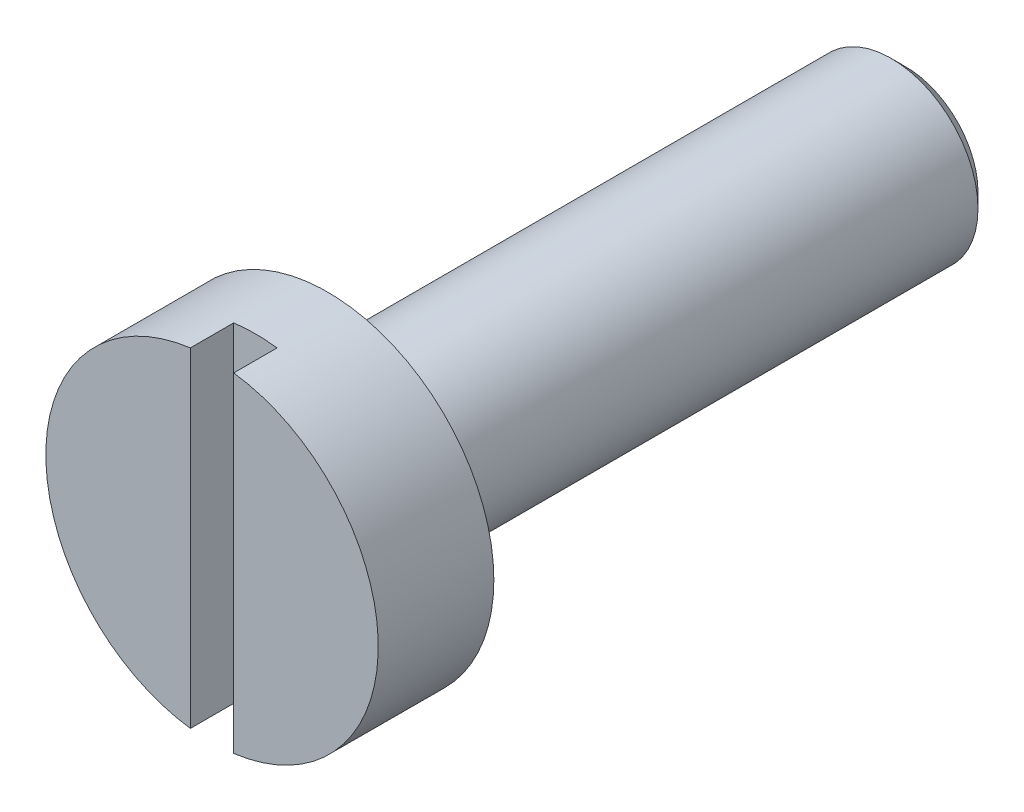
ISO-10303-21;
HEADER;
FILE_DESCRIPTION(('STEP AP214'),'2;1');
FILE_NAME('part.step','',(''),(''),'','','');
FILE_SCHEMA(('AUTOMOTIVE_DESIGN { 1 0 10303 214 1 1 1 1 }'));
ENDSEC;
DATA;
#1=APPLICATION_CONTEXT('core data for automotive mechanical design processes');
#2=APPLICATION_PROTOCOL_DEFINITION('international standard','automotive_design',2000,#1);
#3=PRODUCT_CONTEXT('',#1,'mechanical');
#4=PRODUCT('Part','Part','',(#3));
#5=PRODUCT_RELATED_PRODUCT_CATEGORY('part','',(#4));
#6=PRODUCT_DEFINITION_FORMATION('','',#4);
#7=PRODUCT_DEFINITION_CONTEXT('part definition',#1,'design');
#8=PRODUCT_DEFINITION('design','',#6,#7);
#9=PRODUCT_DEFINITION_SHAPE('','',#8);
#10=(LENGTH_UNIT() NAMED_UNIT(*) SI_UNIT(.MILLI.,.METRE.));
#11=(NAMED_UNIT(*) PLANE_ANGLE_UNIT() SI_UNIT($,.RADIAN.));
#12=(NAMED_UNIT(*) SI_UNIT($,.STERADIAN.) SOLID_ANGLE_UNIT());
#13=UNCERTAINTY_MEASURE_WITH_UNIT(LENGTH_MEASURE(1.E-05),#10,'distance_accuracy_value','');
#14=(GEOMETRIC_REPRESENTATION_CONTEXT(3) GLOBAL_UNCERTAINTY_ASSIGNED_CONTEXT((#13)) GLOBAL_UNIT_ASSIGNED_CONTEXT((#10,
#11,#12)) REPRESENTATION_CONTEXT('',''));
#15=CARTESIAN_POINT('',(0.,0.,0.));
#16=DIRECTION('',(0.,0.,1.));
#17=DIRECTION('',(1.,0.,0.));
#18=AXIS2_PLACEMENT_3D('',#15,#16,#17);
#19=CARTESIAN_POINT('',(0.,0.,0.8));
#20=DIRECTION('',(0.,0.,1.));
#21=DIRECTION('',(1.,0.,0.));
#22=AXIS2_PLACEMENT_3D('',#19,#20,#21);
#23=PLANE('',#22);
#24=DIRECTION('',(0.,-1.,0.));
#25=VECTOR('',#24,1.);
#26=CARTESIAN_POINT('',(-0.15,0.,0.8));
#27=LINE('',#26,#25);
#28=CARTESIAN_POINT('',(-0.15,1.14017542509914,0.8));
#29=VERTEX_POINT('',#28);
#30=CARTESIAN_POINT('',(-0.15,-1.14017542509914,0.8));
#31=VERTEX_POINT('',#30);
#32=EDGE_CURVE('E83',#29,#31,#27,.T.);
#33=ORIENTED_EDGE('',*,*,#32,.F.);
#34=CARTESIAN_POINT('',(0.,0.,0.8));
#35=DIRECTION('',(0.,0.,1.));
#36=DIRECTION('',(1.,0.,0.));
#37=AXIS2_PLACEMENT_3D('',#34,#35,#36);
#38=CIRCLE('',#37,1.15);
#39=EDGE_CURVE('E96',#29,#31,#38,.T.);
#40=ORIENTED_EDGE('',*,*,#39,.T.);
#41=EDGE_LOOP('',(#33,#40));
#42=FACE_BOUND('',#41,.T.);
#43=ADVANCED_FACE('F36',(#42),#23,.T.);
#44=CARTESIAN_POINT('',(0.,0.,0.8));
#45=DIRECTION('',(0.,0.,-1.));
#46=DIRECTION('',(-1.,0.,0.));
#47=AXIS2_PLACEMENT_3D('',#44,#45,#46);
#48=CYLINDRICAL_SURFACE('',#47,1.15);
#49=ORIENTED_EDGE('',*,*,#39,.F.);
#50=DIRECTION('',(0.,0.,-1.));
#51=VECTOR('',#50,1.);
#52=CARTESIAN_POINT('',(-0.15,1.14017542509914,0.8));
#53=LINE('',#52,#51);
#54=CARTESIAN_POINT('',(-0.15,1.14017542509914,0.5));
#55=VERTEX_POINT('',#54);
#56=EDGE_CURVE('E117',#29,#55,#53,.T.);
#57=ORIENTED_EDGE('',*,*,#56,.T.);
#58=CARTESIAN_POINT('',(0.,0.,0.5));
#59=DIRECTION('',(0.,0.,1.));
#60=DIRECTION('',(1.,0.,0.));
#61=AXIS2_PLACEMENT_3D('',#58,#59,#60);
#62=CIRCLE('',#61,1.15);
#63=CARTESIAN_POINT('',(0.15,1.14017542509914,0.5));
#64=VERTEX_POINT('',#63);
#65=EDGE_CURVE('E11',#64,#55,#62,.T.);
#66=ORIENTED_EDGE('',*,*,#65,.F.);
#67=DIRECTION('',(0.,0.,-1.));
#68=VECTOR('',#67,1.);
#69=CARTESIAN_POINT('',(0.15,1.14017542509914,0.8));
#70=LINE('',#69,#68);
#71=CARTESIAN_POINT('',(0.15,1.14017542509914,0.8));
#72=VERTEX_POINT('',#71);
#73=EDGE_CURVE('E78',#64,#72,#70,.F.);
#74=ORIENTED_EDGE('',*,*,#73,.T.);
#75=CARTESIAN_POINT('',(0.15,-1.14017542509914,0.8));
#76=VERTEX_POINT('',#75);
#77=EDGE_CURVE('E91',#76,#72,#38,.T.);
#78=ORIENTED_EDGE('',*,*,#77,.F.);
#79=DIRECTION('',(0.,0.,-1.));
#80=VECTOR('',#79,1.);
#81=CARTESIAN_POINT('',(0.15,-1.14017542509914,0.8));
#82=LINE('',#81,#80);
#83=CARTESIAN_POINT('',(0.15,-1.14017542509914,0.5));
#84=VERTEX_POINT('',#83);
#85=EDGE_CURVE('E51',#76,#84,#82,.T.);
#86=ORIENTED_EDGE('',*,*,#85,.T.);
#87=CARTESIAN_POINT('',(-0.15,-1.14017542509914,0.5));
#88=VERTEX_POINT('',#87);
#89=EDGE_CURVE('E40',#88,#84,#62,.T.);
#90=ORIENTED_EDGE('',*,*,#89,.F.);
#91=DIRECTION('',(0.,0.,-1.));
#92=VECTOR('',#91,1.);
#93=CARTESIAN_POINT('',(-0.15,-1.14017542509914,0.8));
#94=LINE('',#93,#92);
#95=EDGE_CURVE('E59',#88,#31,#94,.F.);
#96=ORIENTED_EDGE('',*,*,#95,.T.);
#97=EDGE_LOOP('',(#49,#57,#66,#74,#78,#86,#90,#96));
#98=FACE_BOUND('',#97,.T.);
#99=CARTESIAN_POINT('',(0.,0.,0.));
#100=DIRECTION('',(0.,0.,1.));
#101=DIRECTION('',(1.,0.,0.));
#102=AXIS2_PLACEMENT_3D('',#99,#100,#101);
#103=CIRCLE('',#102,1.15);
#104=CARTESIAN_POINT('',(1.15,0.,0.));
#105=VERTEX_POINT('',#104);
#106=EDGE_CURVE('E97',#105,#105,#103,.T.);
#107=ORIENTED_EDGE('',*,*,#106,.T.);
#108=EDGE_LOOP('',(#107));
#109=FACE_BOUND('',#108,.T.);
#110=ADVANCED_FACE('F89',(#98,#109),#48,.T.);
#111=DIRECTION('',(0.,1.,0.));
#112=VECTOR('',#111,1.);
#113=CARTESIAN_POINT('',(0.15,0.,0.8));
#114=LINE('',#113,#112);
#115=EDGE_CURVE('E75',#76,#72,#114,.T.);
#116=ORIENTED_EDGE('',*,*,#115,.F.);
#117=ORIENTED_EDGE('',*,*,#77,.T.);
#118=EDGE_LOOP('',(#116,#117));
#119=FACE_BOUND('',#118,.T.);
#120=ADVANCED_FACE('F95',(#119),#23,.T.);
#121=CARTESIAN_POINT('',(0.,0.,0.));
#122=DIRECTION('',(0.,0.,1.));
#123=DIRECTION('',(1.,0.,0.));
#124=AXIS2_PLACEMENT_3D('',#121,#122,#123);
#125=PLANE('',#124);
#126=CARTESIAN_POINT('',(0.,0.,0.));
#127=DIRECTION('',(0.,0.,1.));
#128=DIRECTION('',(1.,0.,0.));
#129=AXIS2_PLACEMENT_3D('',#126,#127,#128);
#130=CIRCLE('',#129,0.6);
#131=CARTESIAN_POINT('',(0.6,0.,0.));
#132=VERTEX_POINT('',#131);
#133=EDGE_CURVE('E102',#132,#132,#130,.T.);
#134=ORIENTED_EDGE('',*,*,#133,.T.);
#135=EDGE_LOOP('',(#134));
#136=FACE_BOUND('',#135,.T.);
#137=ORIENTED_EDGE('',*,*,#106,.F.);
#138=EDGE_LOOP('',(#137));
#139=FACE_BOUND('',#138,.T.);
#140=ADVANCED_FACE('F122',(#136,#139),#125,.F.);
#141=CARTESIAN_POINT('',(0.,0.,-4.));
#142=DIRECTION('',(0.,0.,1.));
#143=DIRECTION('',(1.,0.,0.));
#144=AXIS2_PLACEMENT_3D('',#141,#142,#143);
#145=CYLINDRICAL_SURFACE('',#144,0.6);
#146=CARTESIAN_POINT('',(0.,0.,-3.9));
#147=DIRECTION('',(0.,0.,1.));
#148=DIRECTION('',(1.,0.,0.));
#149=AXIS2_PLACEMENT_3D('',#146,#147,#148);
#150=CIRCLE('',#149,0.6);
#151=CARTESIAN_POINT('',(0.6,0.,-3.9));
#152=VERTEX_POINT('',#151);
#153=EDGE_CURVE('E100',#152,#152,#150,.T.);
#154=ORIENTED_EDGE('',*,*,#153,.T.);
#155=EDGE_LOOP('',(#154));
#156=FACE_BOUND('',#155,.T.);
#157=ORIENTED_EDGE('',*,*,#133,.F.);
#158=EDGE_LOOP('',(#157));
#159=FACE_BOUND('',#158,.T.);
#160=ADVANCED_FACE('F125',(#156,#159),#145,.T.);
#161=CARTESIAN_POINT('',(0.,0.,-4.));
#162=DIRECTION('',(0.,0.,1.));
#163=DIRECTION('',(1.,0.,0.));
#164=AXIS2_PLACEMENT_3D('',#161,#162,#163);
#165=PLANE('',#164);
#166=CARTESIAN_POINT('',(0.,0.,-4.));
#167=DIRECTION('',(0.,0.,1.));
#168=DIRECTION('',(1.,0.,0.));
#169=AXIS2_PLACEMENT_3D('',#166,#167,#168);
#170=CIRCLE('',#169,0.5);
#171=CARTESIAN_POINT('',(0.5,0.,-4.));
#172=VERTEX_POINT('',#171);
#173=EDGE_CURVE('E84',#172,#172,#170,.F.);
#174=ORIENTED_EDGE('',*,*,#173,.T.);
#175=EDGE_LOOP('',(#174));
#176=FACE_BOUND('',#175,.T.);
#177=ADVANCED_FACE('F127',(#176),#165,.F.);
#178=CARTESIAN_POINT('',(0.,0.,-3.9));
#179=DIRECTION('',(0.,0.,1.));
#180=DIRECTION('',(1.,0.,0.));
#181=AXIS2_PLACEMENT_3D('',#178,#179,#180);
#182=CONICAL_SURFACE('',#181,0.6,0.785398163397451);
#183=ORIENTED_EDGE('',*,*,#173,.F.);
#184=EDGE_LOOP('',(#183));
#185=FACE_BOUND('',#184,.T.);
#186=ORIENTED_EDGE('',*,*,#153,.F.);
#187=EDGE_LOOP('',(#186));
#188=FACE_BOUND('',#187,.T.);
#189=ADVANCED_FACE('F38',(#185,#188),#182,.T.);
#190=CARTESIAN_POINT('',(0.,0.,0.5));
#191=DIRECTION('',(0.,0.,1.));
#192=DIRECTION('',(1.,0.,0.));
#193=AXIS2_PLACEMENT_3D('',#190,#191,#192);
#194=PLANE('',#193);
#195=ORIENTED_EDGE('',*,*,#65,.T.);
#196=DIRECTION('',(0.,-1.,0.));
#197=VECTOR('',#196,1.);
#198=CARTESIAN_POINT('',(-0.15,-1.19461020399294,0.5));
#199=LINE('',#198,#197);
#200=EDGE_CURVE('E114',#55,#88,#199,.T.);
#201=ORIENTED_EDGE('',*,*,#200,.T.);
#202=ORIENTED_EDGE('',*,*,#89,.T.);
#203=DIRECTION('',(0.,1.,0.));
#204=VECTOR('',#203,1.);
#205=CARTESIAN_POINT('',(0.15,-1.19461020399294,0.5));
#206=LINE('',#205,#204);
#207=EDGE_CURVE('E93',#84,#64,#206,.T.);
#208=ORIENTED_EDGE('',*,*,#207,.T.);
#209=EDGE_LOOP('',(#195,#201,#202,#208));
#210=FACE_BOUND('',#209,.T.);
#211=ADVANCED_FACE('F113',(#210),#194,.T.);
#212=CARTESIAN_POINT('',(-0.15,-1.19461020399294,0.5));
#213=DIRECTION('',(-1.,0.,0.));
#214=DIRECTION('',(0.,0.,1.));
#215=AXIS2_PLACEMENT_3D('',#212,#213,#214);
#216=PLANE('',#215);
#217=ORIENTED_EDGE('',*,*,#32,.T.);
#218=ORIENTED_EDGE('',*,*,#95,.F.);
#219=ORIENTED_EDGE('',*,*,#200,.F.);
#220=ORIENTED_EDGE('',*,*,#56,.F.);
#221=EDGE_LOOP('',(#217,#218,#219,#220));
#222=FACE_BOUND('',#221,.T.);
#223=ADVANCED_FACE('F190',(#222),#216,.F.);
#224=CARTESIAN_POINT('',(0.15,-1.19461020399294,0.5));
#225=DIRECTION('',(1.,0.,0.));
#226=DIRECTION('',(0.,0.,-1.));
#227=AXIS2_PLACEMENT_3D('',#224,#225,#226);
#228=PLANE('',#227);
#229=ORIENTED_EDGE('',*,*,#115,.T.);
#230=ORIENTED_EDGE('',*,*,#73,.F.);
#231=ORIENTED_EDGE('',*,*,#207,.F.);
#232=ORIENTED_EDGE('',*,*,#85,.F.);
#233=EDGE_LOOP('',(#229,#230,#231,#232));
#234=FACE_BOUND('',#233,.T.);
#235=ADVANCED_FACE('F77',(#234),#228,.F.);
#236=CLOSED_SHELL('',(#43,#110,#120,#140,#160,#177,#189,#211,#223,#235));
#237=MANIFOLD_SOLID_BREP('B2',#236);
#238=ADVANCED_BREP_SHAPE_REPRESENTATION('',(#18,#237),#14);
#239=SHAPE_DEFINITION_REPRESENTATION(#9,#238);
ENDSEC;
END-ISO-10303-21;
